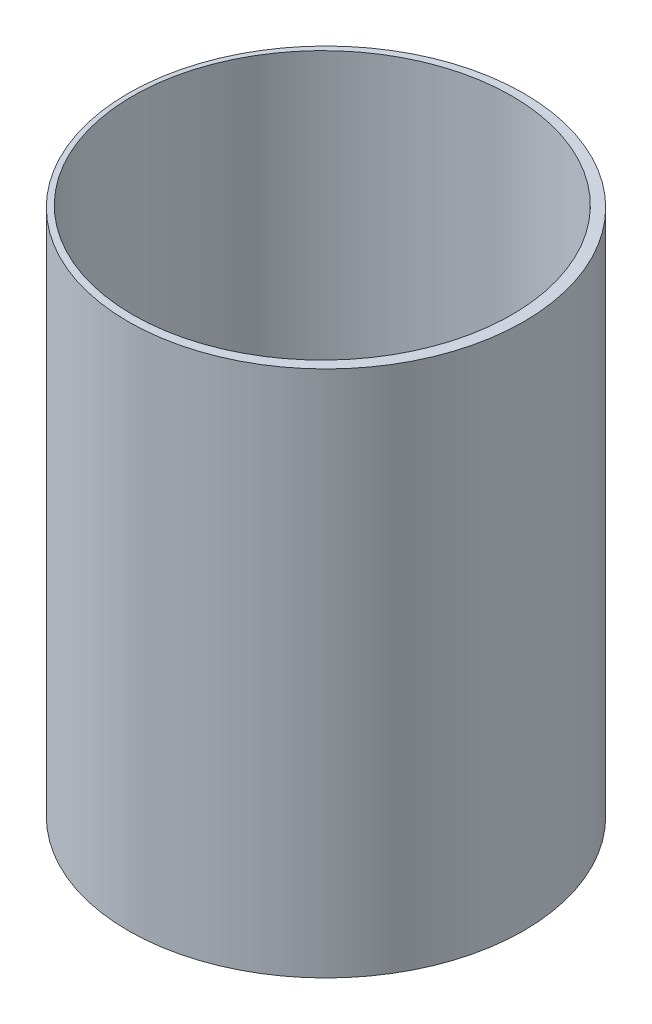
ISO-10303-21;
HEADER;
FILE_DESCRIPTION(('STEP AP214'),'2;1');
FILE_NAME('part.step','',(''),(''),'','','');
FILE_SCHEMA(('AUTOMOTIVE_DESIGN { 1 0 10303 214 1 1 1 1 }'));
ENDSEC;
DATA;
#1=APPLICATION_CONTEXT('core data for automotive mechanical design processes');
#2=APPLICATION_PROTOCOL_DEFINITION('international standard','automotive_design',2000,#1);
#3=PRODUCT_CONTEXT('',#1,'mechanical');
#4=PRODUCT('Part','Part','',(#3));
#5=PRODUCT_RELATED_PRODUCT_CATEGORY('part','',(#4));
#6=PRODUCT_DEFINITION_FORMATION('','',#4);
#7=PRODUCT_DEFINITION_CONTEXT('part definition',#1,'design');
#8=PRODUCT_DEFINITION('design','',#6,#7);
#9=PRODUCT_DEFINITION_SHAPE('','',#8);
#10=(LENGTH_UNIT() NAMED_UNIT(*) SI_UNIT(.MILLI.,.METRE.));
#11=(NAMED_UNIT(*) PLANE_ANGLE_UNIT() SI_UNIT($,.RADIAN.));
#12=(NAMED_UNIT(*) SI_UNIT($,.STERADIAN.) SOLID_ANGLE_UNIT());
#13=UNCERTAINTY_MEASURE_WITH_UNIT(LENGTH_MEASURE(1.E-05),#10,'distance_accuracy_value','');
#14=(GEOMETRIC_REPRESENTATION_CONTEXT(3) GLOBAL_UNCERTAINTY_ASSIGNED_CONTEXT((#13)) GLOBAL_UNIT_ASSIGNED_CONTEXT((#10,
#11,#12)) REPRESENTATION_CONTEXT('',''));
#15=CARTESIAN_POINT('',(0.,0.,0.));
#16=DIRECTION('',(0.,0.,1.));
#17=DIRECTION('',(1.,0.,0.));
#18=AXIS2_PLACEMENT_3D('',#15,#16,#17);
#19=CARTESIAN_POINT('',(0.,152.4,0.));
#20=DIRECTION('',(0.,-1.,0.));
#21=DIRECTION('',(0.,0.,-1.));
#22=AXIS2_PLACEMENT_3D('',#19,#20,#21);
#23=CYLINDRICAL_SURFACE('',#22,57.15);
#24=CARTESIAN_POINT('',(0.,152.4,0.));
#25=DIRECTION('',(0.,1.,0.));
#26=DIRECTION('',(0.,0.,1.));
#27=AXIS2_PLACEMENT_3D('',#24,#25,#26);
#28=CIRCLE('',#27,57.15);
#29=CARTESIAN_POINT('',(0.,152.4,-57.15));
#30=VERTEX_POINT('',#29);
#31=EDGE_CURVE('E10',#30,#30,#28,.T.);
#32=CARTESIAN_POINT('',(0.,0.,0.));
#33=DIRECTION('',(0.,1.,0.));
#34=DIRECTION('',(0.,0.,1.));
#35=AXIS2_PLACEMENT_3D('',#32,#33,#34);
#36=CIRCLE('',#35,57.15);
#37=CARTESIAN_POINT('',(0.,0.,-57.15));
#38=VERTEX_POINT('',#37);
#39=EDGE_CURVE('E45',#38,#38,#36,.T.);
#40=CARTESIAN_POINT('',(0.,152.4,-57.15));
#41=CARTESIAN_POINT('',(0.,150.8125,-57.15));
#42=CARTESIAN_POINT('',(0.,149.225,-57.15));
#43=CARTESIAN_POINT('',(0.,146.05,-57.15));
#44=CARTESIAN_POINT('',(0.,144.4625,-57.15));
#45=CARTESIAN_POINT('',(0.,141.2875,-57.15));
#46=CARTESIAN_POINT('',(0.,139.7,-57.15));
#47=CARTESIAN_POINT('',(0.,136.525,-57.15));
#48=CARTESIAN_POINT('',(0.,134.9375,-57.15));
#49=CARTESIAN_POINT('',(0.,131.7625,-57.15));
#50=CARTESIAN_POINT('',(0.,130.175,-57.15));
#51=CARTESIAN_POINT('',(0.,127.,-57.15));
#52=CARTESIAN_POINT('',(0.,125.4125,-57.15));
#53=CARTESIAN_POINT('',(0.,122.2375,-57.15));
#54=CARTESIAN_POINT('',(0.,120.65,-57.15));
#55=CARTESIAN_POINT('',(0.,117.475,-57.15));
#56=CARTESIAN_POINT('',(0.,115.8875,-57.15));
#57=CARTESIAN_POINT('',(0.,112.7125,-57.15));
#58=CARTESIAN_POINT('',(0.,111.125,-57.15));
#59=CARTESIAN_POINT('',(0.,107.95,-57.15));
#60=CARTESIAN_POINT('',(0.,106.3625,-57.15));
#61=CARTESIAN_POINT('',(0.,103.1875,-57.15));
#62=CARTESIAN_POINT('',(0.,101.6,-57.15));
#63=CARTESIAN_POINT('',(0.,98.425,-57.15));
#64=CARTESIAN_POINT('',(0.,96.8375,-57.15));
#65=CARTESIAN_POINT('',(0.,93.6625,-57.15));
#66=CARTESIAN_POINT('',(0.,92.075,-57.15));
#67=CARTESIAN_POINT('',(0.,88.9,-57.15));
#68=CARTESIAN_POINT('',(0.,87.3125,-57.15));
#69=CARTESIAN_POINT('',(0.,84.1375,-57.15));
#70=CARTESIAN_POINT('',(0.,82.55,-57.15));
#71=CARTESIAN_POINT('',(0.,79.375,-57.15));
#72=CARTESIAN_POINT('',(0.,77.7875,-57.15));
#73=CARTESIAN_POINT('',(0.,74.6125,-57.15));
#74=CARTESIAN_POINT('',(0.,73.025,-57.15));
#75=CARTESIAN_POINT('',(0.,69.85,-57.15));
#76=CARTESIAN_POINT('',(0.,68.2625,-57.15));
#77=CARTESIAN_POINT('',(0.,65.0875,-57.15));
#78=CARTESIAN_POINT('',(0.,63.5,-57.15));
#79=CARTESIAN_POINT('',(0.,60.325,-57.15));
#80=CARTESIAN_POINT('',(0.,58.7375,-57.15));
#81=CARTESIAN_POINT('',(0.,55.5625,-57.15));
#82=CARTESIAN_POINT('',(0.,53.975,-57.15));
#83=CARTESIAN_POINT('',(0.,50.8,-57.15));
#84=CARTESIAN_POINT('',(0.,49.2125,-57.15));
#85=CARTESIAN_POINT('',(0.,46.0375,-57.15));
#86=CARTESIAN_POINT('',(0.,44.45,-57.15));
#87=CARTESIAN_POINT('',(0.,41.275,-57.15));
#88=CARTESIAN_POINT('',(0.,39.6875,-57.15));
#89=CARTESIAN_POINT('',(0.,36.5125,-57.15));
#90=CARTESIAN_POINT('',(0.,34.925,-57.15));
#91=CARTESIAN_POINT('',(0.,31.75,-57.15));
#92=CARTESIAN_POINT('',(0.,30.1625,-57.15));
#93=CARTESIAN_POINT('',(0.,26.9875,-57.15));
#94=CARTESIAN_POINT('',(0.,25.4,-57.15));
#95=CARTESIAN_POINT('',(0.,22.225,-57.15));
#96=CARTESIAN_POINT('',(0.,20.6375,-57.15));
#97=CARTESIAN_POINT('',(0.,17.4625,-57.15));
#98=CARTESIAN_POINT('',(0.,15.875,-57.15));
#99=CARTESIAN_POINT('',(0.,12.7,-57.15));
#100=CARTESIAN_POINT('',(0.,11.1125,-57.15));
#101=CARTESIAN_POINT('',(0.,7.93750000000001,-57.15));
#102=CARTESIAN_POINT('',(0.,6.35,-57.15));
#103=CARTESIAN_POINT('',(0.,3.175,-57.15));
#104=CARTESIAN_POINT('',(0.,1.5875,-57.15));
#105=CARTESIAN_POINT('',(0.,0.,-57.15));
#106=B_SPLINE_CURVE_WITH_KNOTS('',3,(#40,#41,#42,#43,#44,#45,#46,#47,#48,#49,#50,#51,#52,#53,
#54,#55,#56,#57,#58,#59,#60,#61,#62,#63,#64,#65,#66,#67,#68,#69,#70,#71,#72,#73,#74,#75,#76,#77,
#78,#79,#80,#81,#82,#83,#84,#85,#86,#87,#88,#89,#90,#91,#92,#93,#94,#95,#96,#97,#98,#99,#100,
#101,#102,#103,#104,#105),.UNSPECIFIED.,.F.,.F.,(4,2,2,2,2,2,2,2,2,2,2,2,2,2,2,2,2,2,2,2,2,2,2,
2,2,2,2,2,2,2,2,2,4),(0.,4.76249999999998,9.52499999999998,14.2875,19.05,23.8125,28.575,33.3375,
38.1,42.8625,47.625,52.3875,57.15,61.9125,66.675,71.4375,76.2,80.9625,85.725,90.4875,95.25,
100.0125,104.775,109.5375,114.3,119.0625,123.825,128.5875,133.35,138.1125,142.875,147.6375,
152.4),.UNSPECIFIED.);
#107=EDGE_CURVE('BSEAM37',#30,#38,#106,.T.);
#108=ORIENTED_EDGE('',*,*,#31,.F.);
#109=ORIENTED_EDGE('',*,*,#39,.T.);
#110=ORIENTED_EDGE('',*,*,#107,.T.);
#111=ORIENTED_EDGE('',*,*,#107,.F.);
#112=EDGE_LOOP('',(#108,#110,#109,#111));
#113=FACE_BOUND('',#112,.T.);
#114=ADVANCED_FACE('F37',(#113),#23,.T.);
#115=CARTESIAN_POINT('',(0.,152.4,0.));
#116=DIRECTION('',(0.,1.,0.));
#117=DIRECTION('',(0.,0.,1.));
#118=AXIS2_PLACEMENT_3D('',#115,#116,#117);
#119=PLANE('',#118);
#120=CARTESIAN_POINT('',(-1.06366534218014,152.4,0.));
#121=DIRECTION('',(0.,1.,0.));
#122=DIRECTION('',(0.,0.,1.));
#123=AXIS2_PLACEMENT_3D('',#120,#121,#122);
#124=CIRCLE('',#123,54.76875);
#125=CARTESIAN_POINT('',(-1.06366534218014,152.4,54.76875));
#126=VERTEX_POINT('',#125);
#127=EDGE_CURVE('E52',#126,#126,#124,.T.);
#128=ORIENTED_EDGE('',*,*,#127,.F.);
#129=EDGE_LOOP('',(#128));
#130=FACE_BOUND('',#129,.T.);
#131=ORIENTED_EDGE('',*,*,#31,.T.);
#132=EDGE_LOOP('',(#131));
#133=FACE_BOUND('',#132,.T.);
#134=ADVANCED_FACE('F70',(#130,#133),#119,.T.);
#135=CARTESIAN_POINT('',(0.,0.,0.));
#136=DIRECTION('',(0.,1.,0.));
#137=DIRECTION('',(0.,0.,1.));
#138=AXIS2_PLACEMENT_3D('',#135,#136,#137);
#139=PLANE('',#138);
#140=CARTESIAN_POINT('',(-1.06366534218014,0.,0.));
#141=DIRECTION('',(0.,1.,0.));
#142=DIRECTION('',(0.,0.,1.));
#143=AXIS2_PLACEMENT_3D('',#140,#141,#142);
#144=CIRCLE('',#143,54.76875);
#145=CARTESIAN_POINT('',(-1.06366534218014,0.,54.76875));
#146=VERTEX_POINT('',#145);
#147=EDGE_CURVE('E40',#146,#146,#144,.T.);
#148=ORIENTED_EDGE('',*,*,#147,.T.);
#149=EDGE_LOOP('',(#148));
#150=FACE_BOUND('',#149,.T.);
#151=ORIENTED_EDGE('',*,*,#39,.F.);
#152=EDGE_LOOP('',(#151));
#153=FACE_BOUND('',#152,.T.);
#154=ADVANCED_FACE('F61',(#150,#153),#139,.F.);
#155=CARTESIAN_POINT('',(-1.06366534218014,-101.6,0.));
#156=DIRECTION('',(0.,1.,0.));
#157=DIRECTION('',(0.,0.,1.));
#158=AXIS2_PLACEMENT_3D('',#155,#156,#157);
#159=CYLINDRICAL_SURFACE('',#158,54.76875);
#160=ORIENTED_EDGE('',*,*,#127,.T.);
#161=EDGE_LOOP('',(#160));
#162=FACE_BOUND('',#161,.T.);
#163=ORIENTED_EDGE('',*,*,#147,.F.);
#164=EDGE_LOOP('',(#163));
#165=FACE_BOUND('',#164,.T.);
#166=ADVANCED_FACE('F64',(#162,#165),#159,.F.);
#167=CLOSED_SHELL('',(#114,#134,#154,#166));
#168=MANIFOLD_SOLID_BREP('B2',#167);
#169=ADVANCED_BREP_SHAPE_REPRESENTATION('',(#18,#168),#14);
#170=SHAPE_DEFINITION_REPRESENTATION(#9,#169);
ENDSEC;
END-ISO-10303-21;
